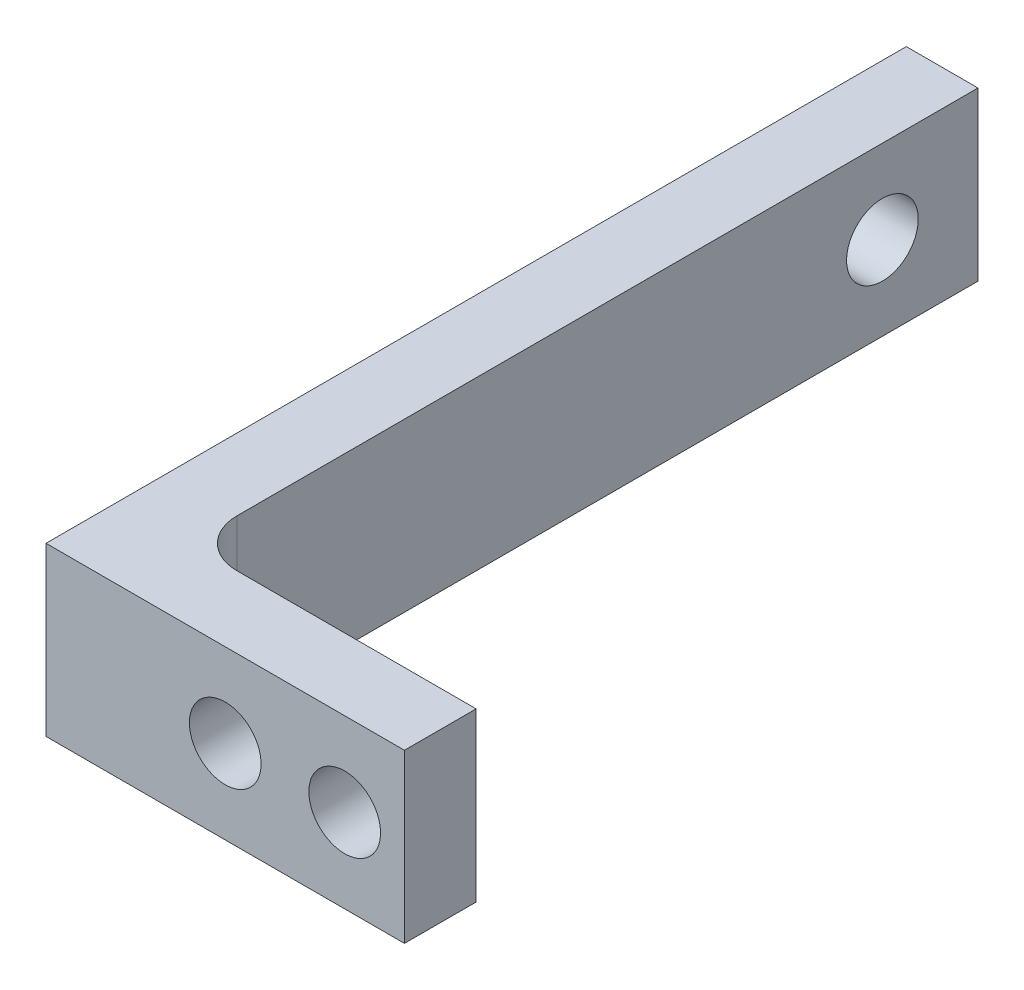
ISO-10303-21;
HEADER;
FILE_DESCRIPTION(('STEP AP214'),'2;1');
FILE_NAME('part.step','',(''),(''),'','','');
FILE_SCHEMA(('AUTOMOTIVE_DESIGN { 1 0 10303 214 1 1 1 1 }'));
ENDSEC;
DATA;
#1=APPLICATION_CONTEXT('core data for automotive mechanical design processes');
#2=APPLICATION_PROTOCOL_DEFINITION('international standard','automotive_design',2000,#1);
#3=PRODUCT_CONTEXT('',#1,'mechanical');
#4=PRODUCT('Part','Part','',(#3));
#5=PRODUCT_RELATED_PRODUCT_CATEGORY('part','',(#4));
#6=PRODUCT_DEFINITION_FORMATION('','',#4);
#7=PRODUCT_DEFINITION_CONTEXT('part definition',#1,'design');
#8=PRODUCT_DEFINITION('design','',#6,#7);
#9=PRODUCT_DEFINITION_SHAPE('','',#8);
#10=(LENGTH_UNIT() NAMED_UNIT(*) SI_UNIT(.MILLI.,.METRE.));
#11=(NAMED_UNIT(*) PLANE_ANGLE_UNIT() SI_UNIT($,.RADIAN.));
#12=(NAMED_UNIT(*) SI_UNIT($,.STERADIAN.) SOLID_ANGLE_UNIT());
#13=UNCERTAINTY_MEASURE_WITH_UNIT(LENGTH_MEASURE(1.E-05),#10,'distance_accuracy_value','');
#14=(GEOMETRIC_REPRESENTATION_CONTEXT(3) GLOBAL_UNCERTAINTY_ASSIGNED_CONTEXT((#13)) GLOBAL_UNIT_ASSIGNED_CONTEXT((#10,
#11,#12)) REPRESENTATION_CONTEXT('',''));
#15=CARTESIAN_POINT('',(0.,0.,0.));
#16=DIRECTION('',(0.,0.,1.));
#17=DIRECTION('',(1.,0.,0.));
#18=AXIS2_PLACEMENT_3D('',#15,#16,#17);
#19=CARTESIAN_POINT('',(0.,7.,0.));
#20=DIRECTION('',(0.,0.,-1.));
#21=DIRECTION('',(-1.,0.,0.));
#22=AXIS2_PLACEMENT_3D('',#19,#20,#21);
#23=PLANE('',#22);
#24=CARTESIAN_POINT('',(12.5,3.5,0.));
#25=DIRECTION('',(0.,0.,-1.));
#26=DIRECTION('',(-1.,0.,0.));
#27=AXIS2_PLACEMENT_3D('',#24,#25,#26);
#28=CIRCLE('',#27,1.5);
#29=CARTESIAN_POINT('',(11.,3.5,0.));
#30=VERTEX_POINT('',#29);
#31=EDGE_CURVE('E136',#30,#30,#28,.T.);
#32=ORIENTED_EDGE('',*,*,#31,.T.);
#33=EDGE_LOOP('',(#32));
#34=FACE_BOUND('',#33,.T.);
#35=CARTESIAN_POINT('',(7.5,3.5,0.));
#36=DIRECTION('',(0.,0.,-1.));
#37=DIRECTION('',(-1.,0.,0.));
#38=AXIS2_PLACEMENT_3D('',#35,#36,#37);
#39=CIRCLE('',#38,1.5);
#40=CARTESIAN_POINT('',(6.,3.5,0.));
#41=VERTEX_POINT('',#40);
#42=EDGE_CURVE('E122',#41,#41,#39,.T.);
#43=ORIENTED_EDGE('',*,*,#42,.T.);
#44=EDGE_LOOP('',(#43));
#45=FACE_BOUND('',#44,.T.);
#46=DIRECTION('',(1.,0.,0.));
#47=VECTOR('',#46,1.);
#48=CARTESIAN_POINT('',(0.,0.,0.));
#49=LINE('',#48,#47);
#50=CARTESIAN_POINT('',(0.,0.,0.));
#51=VERTEX_POINT('',#50);
#52=CARTESIAN_POINT('',(15.,0.,0.));
#53=VERTEX_POINT('',#52);
#54=EDGE_CURVE('E161',#51,#53,#49,.T.);
#55=ORIENTED_EDGE('',*,*,#54,.T.);
#56=DIRECTION('',(0.,1.,0.));
#57=VECTOR('',#56,1.);
#58=CARTESIAN_POINT('',(15.,7.,0.));
#59=LINE('',#58,#57);
#60=CARTESIAN_POINT('',(15.,7.,0.));
#61=VERTEX_POINT('',#60);
#62=EDGE_CURVE('E130',#53,#61,#59,.T.);
#63=ORIENTED_EDGE('',*,*,#62,.T.);
#64=DIRECTION('',(1.,0.,0.));
#65=VECTOR('',#64,1.);
#66=CARTESIAN_POINT('',(0.,7.,0.));
#67=LINE('',#66,#65);
#68=CARTESIAN_POINT('',(0.,7.,0.));
#69=VERTEX_POINT('',#68);
#70=EDGE_CURVE('E150',#69,#61,#67,.T.);
#71=ORIENTED_EDGE('',*,*,#70,.F.);
#72=DIRECTION('',(0.,-1.,0.));
#73=VECTOR('',#72,1.);
#74=CARTESIAN_POINT('',(0.,7.,0.));
#75=LINE('',#74,#73);
#76=EDGE_CURVE('E172',#69,#51,#75,.T.);
#77=ORIENTED_EDGE('',*,*,#76,.T.);
#78=EDGE_LOOP('',(#55,#63,#71,#77));
#79=FACE_BOUND('',#78,.T.);
#80=ADVANCED_FACE('F59',(#34,#45,#79),#23,.F.);
#81=CARTESIAN_POINT('',(0.,7.,-36.));
#82=DIRECTION('',(0.,0.,-1.));
#83=DIRECTION('',(-1.,0.,0.));
#84=AXIS2_PLACEMENT_3D('',#81,#82,#83);
#85=PLANE('',#84);
#86=DIRECTION('',(1.,0.,0.));
#87=VECTOR('',#86,1.);
#88=CARTESIAN_POINT('',(0.,0.,-36.));
#89=LINE('',#88,#87);
#90=CARTESIAN_POINT('',(0.,0.,-36.));
#91=VERTEX_POINT('',#90);
#92=CARTESIAN_POINT('',(3.,0.,-36.));
#93=VERTEX_POINT('',#92);
#94=EDGE_CURVE('E151',#91,#93,#89,.T.);
#95=ORIENTED_EDGE('',*,*,#94,.F.);
#96=DIRECTION('',(0.,-1.,0.));
#97=VECTOR('',#96,1.);
#98=CARTESIAN_POINT('',(0.,7.,-36.));
#99=LINE('',#98,#97);
#100=CARTESIAN_POINT('',(0.,7.,-36.));
#101=VERTEX_POINT('',#100);
#102=EDGE_CURVE('E158',#101,#91,#99,.T.);
#103=ORIENTED_EDGE('',*,*,#102,.F.);
#104=DIRECTION('',(1.,0.,0.));
#105=VECTOR('',#104,1.);
#106=CARTESIAN_POINT('',(0.,7.,-36.));
#107=LINE('',#106,#105);
#108=CARTESIAN_POINT('',(3.,7.,-36.));
#109=VERTEX_POINT('',#108);
#110=EDGE_CURVE('E155',#101,#109,#107,.T.);
#111=ORIENTED_EDGE('',*,*,#110,.T.);
#112=DIRECTION('',(0.,-1.,0.));
#113=VECTOR('',#112,1.);
#114=CARTESIAN_POINT('',(3.,7.,-36.));
#115=LINE('',#114,#113);
#116=EDGE_CURVE('E169',#109,#93,#115,.T.);
#117=ORIENTED_EDGE('',*,*,#116,.T.);
#118=EDGE_LOOP('',(#95,#103,#111,#117));
#119=FACE_BOUND('',#118,.T.);
#120=ADVANCED_FACE('F189',(#119),#85,.T.);
#121=CARTESIAN_POINT('',(0.,7.,0.));
#122=DIRECTION('',(-1.,0.,0.));
#123=DIRECTION('',(0.,0.,1.));
#124=AXIS2_PLACEMENT_3D('',#121,#122,#123);
#125=PLANE('',#124);
#126=CARTESIAN_POINT('',(0.,3.5,-32.));
#127=DIRECTION('',(-1.,0.,0.));
#128=DIRECTION('',(0.,0.,1.));
#129=AXIS2_PLACEMENT_3D('',#126,#127,#128);
#130=CIRCLE('',#129,1.5);
#131=CARTESIAN_POINT('',(0.,3.5,-30.5));
#132=VERTEX_POINT('',#131);
#133=EDGE_CURVE('E226',#132,#132,#130,.T.);
#134=ORIENTED_EDGE('',*,*,#133,.F.);
#135=EDGE_LOOP('',(#134));
#136=FACE_BOUND('',#135,.T.);
#137=ORIENTED_EDGE('',*,*,#102,.T.);
#138=DIRECTION('',(0.,0.,-1.));
#139=VECTOR('',#138,1.);
#140=CARTESIAN_POINT('',(0.,0.,0.));
#141=LINE('',#140,#139);
#142=EDGE_CURVE('E159',#51,#91,#141,.T.);
#143=ORIENTED_EDGE('',*,*,#142,.F.);
#144=ORIENTED_EDGE('',*,*,#76,.F.);
#145=DIRECTION('',(0.,0.,-1.));
#146=VECTOR('',#145,1.);
#147=CARTESIAN_POINT('',(0.,7.,0.));
#148=LINE('',#147,#146);
#149=EDGE_CURVE('E148',#69,#101,#148,.T.);
#150=ORIENTED_EDGE('',*,*,#149,.T.);
#151=EDGE_LOOP('',(#137,#143,#144,#150));
#152=FACE_BOUND('',#151,.T.);
#153=ADVANCED_FACE('F204',(#136,#152),#125,.T.);
#154=CARTESIAN_POINT('',(3.,7.,0.));
#155=DIRECTION('',(-1.,0.,0.));
#156=DIRECTION('',(0.,0.,1.));
#157=AXIS2_PLACEMENT_3D('',#154,#155,#156);
#158=PLANE('',#157);
#159=CARTESIAN_POINT('',(3.,3.5,-32.));
#160=DIRECTION('',(-1.,0.,0.));
#161=DIRECTION('',(0.,0.,1.));
#162=AXIS2_PLACEMENT_3D('',#159,#160,#161);
#163=CIRCLE('',#162,1.5);
#164=CARTESIAN_POINT('',(3.,3.5,-30.5));
#165=VERTEX_POINT('',#164);
#166=EDGE_CURVE('E224',#165,#165,#163,.T.);
#167=ORIENTED_EDGE('',*,*,#166,.T.);
#168=EDGE_LOOP('',(#167));
#169=FACE_BOUND('',#168,.T.);
#170=DIRECTION('',(0.,0.,-1.));
#171=VECTOR('',#170,1.);
#172=CARTESIAN_POINT('',(3.,7.,0.));
#173=LINE('',#172,#171);
#174=CARTESIAN_POINT('',(3.,7.,-5.));
#175=VERTEX_POINT('',#174);
#176=EDGE_CURVE('E153',#175,#109,#173,.T.);
#177=ORIENTED_EDGE('',*,*,#176,.F.);
#178=DIRECTION('',(0.,-1.,0.));
#179=VECTOR('',#178,1.);
#180=CARTESIAN_POINT('',(3.,7.,-5.));
#181=LINE('',#180,#179);
#182=CARTESIAN_POINT('',(3.,0.,-5.));
#183=VERTEX_POINT('',#182);
#184=EDGE_CURVE('E174',#175,#183,#181,.T.);
#185=ORIENTED_EDGE('',*,*,#184,.T.);
#186=DIRECTION('',(0.,0.,-1.));
#187=VECTOR('',#186,1.);
#188=CARTESIAN_POINT('',(3.,0.,0.));
#189=LINE('',#188,#187);
#190=EDGE_CURVE('E163',#183,#93,#189,.T.);
#191=ORIENTED_EDGE('',*,*,#190,.T.);
#192=ORIENTED_EDGE('',*,*,#116,.F.);
#193=EDGE_LOOP('',(#177,#185,#191,#192));
#194=FACE_BOUND('',#193,.T.);
#195=ADVANCED_FACE('F181',(#169,#194),#158,.F.);
#196=CARTESIAN_POINT('',(0.,0.,0.));
#197=DIRECTION('',(0.,1.,0.));
#198=DIRECTION('',(0.,0.,1.));
#199=AXIS2_PLACEMENT_3D('',#196,#197,#198);
#200=PLANE('',#199);
#201=ORIENTED_EDGE('',*,*,#190,.F.);
#202=CARTESIAN_POINT('',(5.,0.,-5.));
#203=DIRECTION('',(0.,1.,0.));
#204=DIRECTION('',(0.,0.,1.));
#205=AXIS2_PLACEMENT_3D('',#202,#203,#204);
#206=CIRCLE('',#205,2.);
#207=CARTESIAN_POINT('',(5.,0.,-3.));
#208=VERTEX_POINT('',#207);
#209=EDGE_CURVE('E67',#183,#208,#206,.T.);
#210=ORIENTED_EDGE('',*,*,#209,.T.);
#211=DIRECTION('',(1.,0.,0.));
#212=VECTOR('',#211,1.);
#213=CARTESIAN_POINT('',(0.,0.,-3.));
#214=LINE('',#213,#212);
#215=CARTESIAN_POINT('',(15.,0.,-3.));
#216=VERTEX_POINT('',#215);
#217=EDGE_CURVE('E114',#208,#216,#214,.T.);
#218=ORIENTED_EDGE('',*,*,#217,.T.);
#219=DIRECTION('',(0.,0.,1.));
#220=VECTOR('',#219,1.);
#221=CARTESIAN_POINT('',(15.,0.,-3.));
#222=LINE('',#221,#220);
#223=EDGE_CURVE('E118',#216,#53,#222,.T.);
#224=ORIENTED_EDGE('',*,*,#223,.T.);
#225=ORIENTED_EDGE('',*,*,#54,.F.);
#226=ORIENTED_EDGE('',*,*,#142,.T.);
#227=ORIENTED_EDGE('',*,*,#94,.T.);
#228=EDGE_LOOP('',(#201,#210,#218,#224,#225,#226,#227));
#229=FACE_BOUND('',#228,.T.);
#230=ADVANCED_FACE('F116',(#229),#200,.F.);
#231=CARTESIAN_POINT('',(0.,7.,0.));
#232=DIRECTION('',(0.,1.,0.));
#233=DIRECTION('',(0.,0.,1.));
#234=AXIS2_PLACEMENT_3D('',#231,#232,#233);
#235=PLANE('',#234);
#236=ORIENTED_EDGE('',*,*,#110,.F.);
#237=ORIENTED_EDGE('',*,*,#149,.F.);
#238=ORIENTED_EDGE('',*,*,#70,.T.);
#239=DIRECTION('',(0.,0.,1.));
#240=VECTOR('',#239,1.);
#241=CARTESIAN_POINT('',(15.,7.,-3.));
#242=LINE('',#241,#240);
#243=CARTESIAN_POINT('',(15.,7.,-3.));
#244=VERTEX_POINT('',#243);
#245=EDGE_CURVE('E131',#244,#61,#242,.T.);
#246=ORIENTED_EDGE('',*,*,#245,.F.);
#247=DIRECTION('',(1.,0.,0.));
#248=VECTOR('',#247,1.);
#249=CARTESIAN_POINT('',(0.,7.,-3.));
#250=LINE('',#249,#248);
#251=CARTESIAN_POINT('',(5.,7.,-3.));
#252=VERTEX_POINT('',#251);
#253=EDGE_CURVE('E121',#252,#244,#250,.T.);
#254=ORIENTED_EDGE('',*,*,#253,.F.);
#255=CARTESIAN_POINT('',(5.,7.,-5.));
#256=DIRECTION('',(0.,1.,0.));
#257=DIRECTION('',(0.,0.,1.));
#258=AXIS2_PLACEMENT_3D('',#255,#256,#257);
#259=CIRCLE('',#258,2.);
#260=EDGE_CURVE('E12',#252,#175,#259,.F.);
#261=ORIENTED_EDGE('',*,*,#260,.T.);
#262=ORIENTED_EDGE('',*,*,#176,.T.);
#263=EDGE_LOOP('',(#236,#237,#238,#246,#254,#261,#262));
#264=FACE_BOUND('',#263,.T.);
#265=ADVANCED_FACE('F193',(#264),#235,.T.);
#266=CARTESIAN_POINT('',(0.,7.,-3.));
#267=DIRECTION('',(0.,0.,-1.));
#268=DIRECTION('',(-1.,0.,0.));
#269=AXIS2_PLACEMENT_3D('',#266,#267,#268);
#270=PLANE('',#269);
#271=CARTESIAN_POINT('',(12.5,3.5,-3.));
#272=DIRECTION('',(0.,0.,-1.));
#273=DIRECTION('',(-1.,0.,0.));
#274=AXIS2_PLACEMENT_3D('',#271,#272,#273);
#275=CIRCLE('',#274,1.5);
#276=CARTESIAN_POINT('',(11.,3.5,-3.));
#277=VERTEX_POINT('',#276);
#278=EDGE_CURVE('E139',#277,#277,#275,.T.);
#279=ORIENTED_EDGE('',*,*,#278,.F.);
#280=EDGE_LOOP('',(#279));
#281=FACE_BOUND('',#280,.T.);
#282=CARTESIAN_POINT('',(7.5,3.5,-3.));
#283=DIRECTION('',(0.,0.,-1.));
#284=DIRECTION('',(-1.,0.,0.));
#285=AXIS2_PLACEMENT_3D('',#282,#283,#284);
#286=CIRCLE('',#285,1.5);
#287=CARTESIAN_POINT('',(6.,3.5,-3.));
#288=VERTEX_POINT('',#287);
#289=EDGE_CURVE('E142',#288,#288,#286,.T.);
#290=ORIENTED_EDGE('',*,*,#289,.F.);
#291=EDGE_LOOP('',(#290));
#292=FACE_BOUND('',#291,.T.);
#293=ORIENTED_EDGE('',*,*,#217,.F.);
#294=DIRECTION('',(0.,-1.,0.));
#295=VECTOR('',#294,1.);
#296=CARTESIAN_POINT('',(5.,7.,-3.));
#297=LINE('',#296,#295);
#298=EDGE_CURVE('E80',#208,#252,#297,.F.);
#299=ORIENTED_EDGE('',*,*,#298,.T.);
#300=ORIENTED_EDGE('',*,*,#253,.T.);
#301=DIRECTION('',(0.,1.,0.));
#302=VECTOR('',#301,1.);
#303=CARTESIAN_POINT('',(15.,7.,-3.));
#304=LINE('',#303,#302);
#305=EDGE_CURVE('E128',#216,#244,#304,.T.);
#306=ORIENTED_EDGE('',*,*,#305,.F.);
#307=EDGE_LOOP('',(#293,#299,#300,#306));
#308=FACE_BOUND('',#307,.T.);
#309=ADVANCED_FACE('F133',(#281,#292,#308),#270,.T.);
#310=CARTESIAN_POINT('',(5.,7.,-5.));
#311=DIRECTION('',(0.,-1.,0.));
#312=DIRECTION('',(0.,0.,-1.));
#313=AXIS2_PLACEMENT_3D('',#310,#311,#312);
#314=CYLINDRICAL_SURFACE('',#313,2.);
#315=ORIENTED_EDGE('',*,*,#260,.F.);
#316=ORIENTED_EDGE('',*,*,#298,.F.);
#317=ORIENTED_EDGE('',*,*,#209,.F.);
#318=ORIENTED_EDGE('',*,*,#184,.F.);
#319=EDGE_LOOP('',(#315,#316,#317,#318));
#320=FACE_BOUND('',#319,.T.);
#321=ADVANCED_FACE('F61',(#320),#314,.F.);
#322=CARTESIAN_POINT('',(7.5,3.5,4.));
#323=DIRECTION('',(0.,0.,-1.));
#324=DIRECTION('',(-1.,0.,0.));
#325=AXIS2_PLACEMENT_3D('',#322,#323,#324);
#326=CYLINDRICAL_SURFACE('',#325,1.5);
#327=ORIENTED_EDGE('',*,*,#289,.T.);
#328=EDGE_LOOP('',(#327));
#329=FACE_BOUND('',#328,.T.);
#330=ORIENTED_EDGE('',*,*,#42,.F.);
#331=EDGE_LOOP('',(#330));
#332=FACE_BOUND('',#331,.T.);
#333=ADVANCED_FACE('F195',(#329,#332),#326,.F.);
#334=CARTESIAN_POINT('',(15.,7.,-3.));
#335=DIRECTION('',(1.,0.,0.));
#336=DIRECTION('',(0.,0.,-1.));
#337=AXIS2_PLACEMENT_3D('',#334,#335,#336);
#338=PLANE('',#337);
#339=ORIENTED_EDGE('',*,*,#62,.F.);
#340=ORIENTED_EDGE('',*,*,#223,.F.);
#341=ORIENTED_EDGE('',*,*,#305,.T.);
#342=ORIENTED_EDGE('',*,*,#245,.T.);
#343=EDGE_LOOP('',(#339,#340,#341,#342));
#344=FACE_BOUND('',#343,.T.);
#345=ADVANCED_FACE('F126',(#344),#338,.T.);
#346=CARTESIAN_POINT('',(12.5,3.5,0.));
#347=DIRECTION('',(0.,0.,-1.));
#348=DIRECTION('',(-1.,0.,0.));
#349=AXIS2_PLACEMENT_3D('',#346,#347,#348);
#350=CYLINDRICAL_SURFACE('',#349,1.5);
#351=ORIENTED_EDGE('',*,*,#31,.F.);
#352=EDGE_LOOP('',(#351));
#353=FACE_BOUND('',#352,.T.);
#354=ORIENTED_EDGE('',*,*,#278,.T.);
#355=EDGE_LOOP('',(#354));
#356=FACE_BOUND('',#355,.T.);
#357=ADVANCED_FACE('F235',(#353,#356),#350,.F.);
#358=CARTESIAN_POINT('',(3.,3.5,-32.));
#359=DIRECTION('',(-1.,0.,0.));
#360=DIRECTION('',(0.,0.,1.));
#361=AXIS2_PLACEMENT_3D('',#358,#359,#360);
#362=CYLINDRICAL_SURFACE('',#361,1.5);
#363=ORIENTED_EDGE('',*,*,#166,.F.);
#364=EDGE_LOOP('',(#363));
#365=FACE_BOUND('',#364,.T.);
#366=ORIENTED_EDGE('',*,*,#133,.T.);
#367=EDGE_LOOP('',(#366));
#368=FACE_BOUND('',#367,.T.);
#369=ADVANCED_FACE('F238',(#365,#368),#362,.F.);
#370=CLOSED_SHELL('',(#80,#120,#153,#195,#230,#265,#309,#321,#333,#345,#357,#369));
#371=MANIFOLD_SOLID_BREP('B2',#370);
#372=ADVANCED_BREP_SHAPE_REPRESENTATION('',(#18,#371),#14);
#373=SHAPE_DEFINITION_REPRESENTATION(#9,#372);
ENDSEC;
END-ISO-10303-21;
